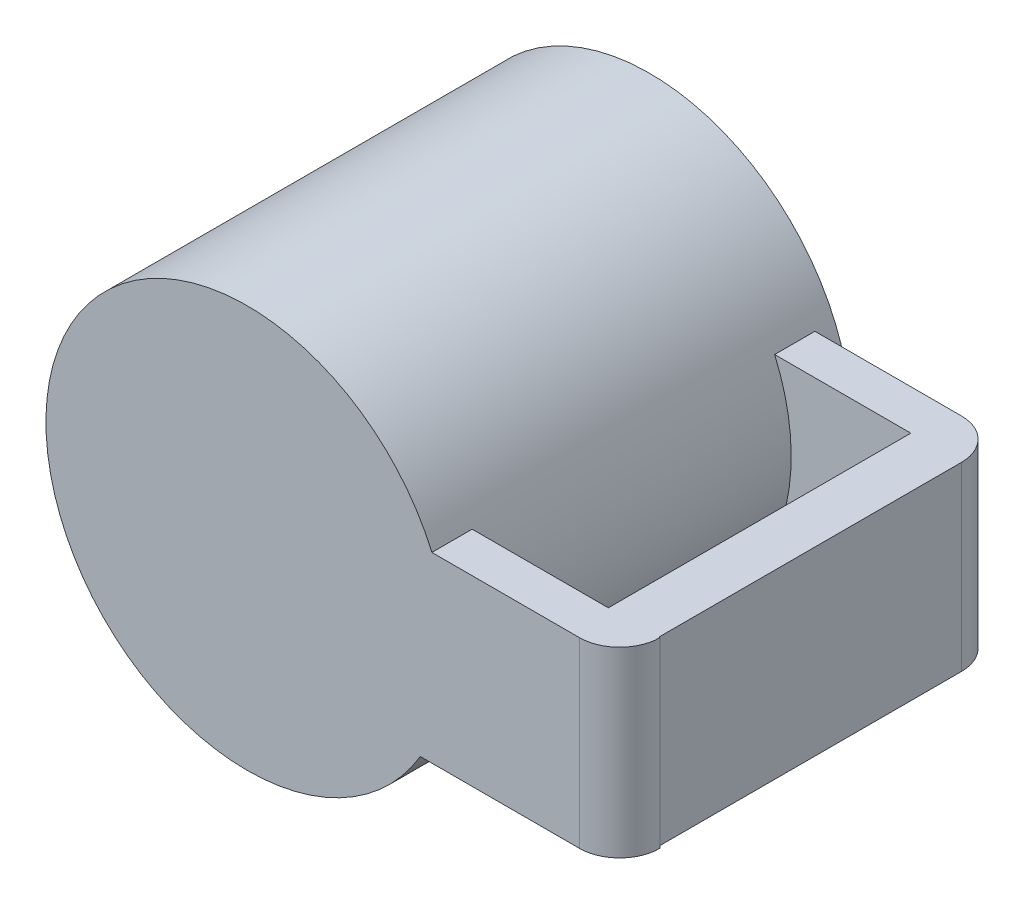
ISO-10303-21;
HEADER;
FILE_DESCRIPTION(('STEP AP214'),'2;1');
FILE_NAME('part.step','',(''),(''),'','','');
FILE_SCHEMA(('AUTOMOTIVE_DESIGN { 1 0 10303 214 1 1 1 1 }'));
ENDSEC;
DATA;
#1=APPLICATION_CONTEXT('core data for automotive mechanical design processes');
#2=APPLICATION_PROTOCOL_DEFINITION('international standard','automotive_design',2000,#1);
#3=PRODUCT_CONTEXT('',#1,'mechanical');
#4=PRODUCT('Part','Part','',(#3));
#5=PRODUCT_RELATED_PRODUCT_CATEGORY('part','',(#4));
#6=PRODUCT_DEFINITION_FORMATION('','',#4);
#7=PRODUCT_DEFINITION_CONTEXT('part definition',#1,'design');
#8=PRODUCT_DEFINITION('design','',#6,#7);
#9=PRODUCT_DEFINITION_SHAPE('','',#8);
#10=(LENGTH_UNIT() NAMED_UNIT(*) SI_UNIT(.MILLI.,.METRE.));
#11=(NAMED_UNIT(*) PLANE_ANGLE_UNIT() SI_UNIT($,.RADIAN.));
#12=(NAMED_UNIT(*) SI_UNIT($,.STERADIAN.) SOLID_ANGLE_UNIT());
#13=UNCERTAINTY_MEASURE_WITH_UNIT(LENGTH_MEASURE(1.E-05),#10,'distance_accuracy_value','');
#14=(GEOMETRIC_REPRESENTATION_CONTEXT(3) GLOBAL_UNCERTAINTY_ASSIGNED_CONTEXT((#13)) GLOBAL_UNIT_ASSIGNED_CONTEXT((#10,
#11,#12)) REPRESENTATION_CONTEXT('',''));
#15=CARTESIAN_POINT('',(0.,0.,0.));
#16=DIRECTION('',(0.,0.,1.));
#17=DIRECTION('',(1.,0.,0.));
#18=AXIS2_PLACEMENT_3D('',#15,#16,#17);
#19=CARTESIAN_POINT('',(-67.2390738972118,0.,0.));
#20=DIRECTION('',(1.,0.,0.));
#21=DIRECTION('',(0.,0.,-1.));
#22=AXIS2_PLACEMENT_3D('',#19,#20,#21);
#23=PLANE('',#22);
#24=DIRECTION('',(0.,-1.,0.));
#25=VECTOR('',#24,1.);
#26=CARTESIAN_POINT('',(-67.2390738972118,4.534999237552,0.484260169593148));
#27=LINE('',#26,#25);
#28=CARTESIAN_POINT('',(-67.2390738972118,0.0349992375519997,0.484260169593148));
#29=VERTEX_POINT('',#28);
#30=CARTESIAN_POINT('',(-67.2390738972118,0.,0.484260169593148));
#31=VERTEX_POINT('',#30);
#32=EDGE_CURVE('E125',#29,#31,#27,.T.);
#33=ORIENTED_EDGE('',*,*,#32,.F.);
#34=DIRECTION('',(0.,0.,1.));
#35=VECTOR('',#34,1.);
#36=CARTESIAN_POINT('',(-67.2390738972118,0.0349992375519997,0.484260169593148));
#37=LINE('',#36,#35);
#38=CARTESIAN_POINT('',(-67.2390738972118,0.0349992375519997,1.48364750860179));
#39=VERTEX_POINT('',#38);
#40=EDGE_CURVE('E135',#29,#39,#37,.T.);
#41=ORIENTED_EDGE('',*,*,#40,.T.);
#42=DIRECTION('',(0.,0.0349992375519997,0.999387339008644));
#43=VECTOR('',#42,1.);
#44=CARTESIAN_POINT('',(-67.2390738972118,0.0349992375519997,1.48364750860179));
#45=LINE('',#44,#43);
#46=EDGE_CURVE('E144',#31,#39,#45,.T.);
#47=ORIENTED_EDGE('',*,*,#46,.F.);
#48=EDGE_LOOP('',(#33,#41,#47));
#49=FACE_BOUND('',#48,.T.);
#50=ADVANCED_FACE('F33',(#49),#23,.T.);
#51=CARTESIAN_POINT('',(-75.2117108329897,2.55000000000001,10.));
#52=DIRECTION('',(0.,0.,-1.));
#53=DIRECTION('',(-1.,0.,0.));
#54=AXIS2_PLACEMENT_3D('',#51,#52,#53);
#55=CYLINDRICAL_SURFACE('',#54,5.);
#56=DIRECTION('',(0.,0.,-1.));
#57=VECTOR('',#56,1.);
#58=CARTESIAN_POINT('',(-70.9108388283841,0.,10.));
#59=LINE('',#58,#57);
#60=CARTESIAN_POINT('',(-70.9108388283841,0.,10.));
#61=VERTEX_POINT('',#60);
#62=CARTESIAN_POINT('',(-70.9108388283841,0.,9.));
#63=VERTEX_POINT('',#62);
#64=EDGE_CURVE('E178',#61,#63,#59,.T.);
#65=ORIENTED_EDGE('',*,*,#64,.F.);
#66=CARTESIAN_POINT('',(-75.2117108329897,2.55000000000001,10.));
#67=DIRECTION('',(0.,0.,1.));
#68=DIRECTION('',(1.,0.,0.));
#69=AXIS2_PLACEMENT_3D('',#66,#67,#68);
#70=CIRCLE('',#69,5.);
#71=CARTESIAN_POINT('',(-70.6226174555437,4.534999237552,10.));
#72=VERTEX_POINT('',#71);
#73=EDGE_CURVE('E182',#72,#61,#70,.T.);
#74=ORIENTED_EDGE('',*,*,#73,.F.);
#75=DIRECTION('',(0.,0.,-1.));
#76=VECTOR('',#75,1.);
#77=CARTESIAN_POINT('',(-70.6226174555437,4.534999237552,10.));
#78=LINE('',#77,#76);
#79=CARTESIAN_POINT('',(-70.6226174555437,4.534999237552,9.));
#80=VERTEX_POINT('',#79);
#81=EDGE_CURVE('E169',#80,#72,#78,.F.);
#82=ORIENTED_EDGE('',*,*,#81,.F.);
#83=CARTESIAN_POINT('',(-75.2117108329897,2.55000000000001,9.));
#84=DIRECTION('',(0.,0.,-1.));
#85=DIRECTION('',(-1.,0.,0.));
#86=AXIS2_PLACEMENT_3D('',#83,#84,#85);
#87=CIRCLE('',#86,5.);
#88=EDGE_CURVE('E185',#80,#63,#87,.T.);
#89=ORIENTED_EDGE('',*,*,#88,.T.);
#90=EDGE_LOOP('',(#65,#74,#82,#89));
#91=FACE_BOUND('',#90,.T.);
#92=CARTESIAN_POINT('',(-75.2117108329897,2.55000000000001,0.));
#93=DIRECTION('',(0.,0.,1.));
#94=DIRECTION('',(1.,0.,0.));
#95=AXIS2_PLACEMENT_3D('',#92,#93,#94);
#96=CIRCLE('',#95,5.);
#97=CARTESIAN_POINT('',(-70.2117108329897,2.55000000000001,0.));
#98=VERTEX_POINT('',#97);
#99=EDGE_CURVE('E181',#98,#98,#96,.T.);
#100=ORIENTED_EDGE('',*,*,#99,.T.);
#101=EDGE_LOOP('',(#100));
#102=FACE_BOUND('',#101,.T.);
#103=DIRECTION('',(0.,0.,-1.));
#104=VECTOR('',#103,1.);
#105=CARTESIAN_POINT('',(-70.6226174555437,4.534999237552,10.));
#106=LINE('',#105,#104);
#107=CARTESIAN_POINT('',(-70.6226174555437,4.534999237552,0.484260169593147));
#108=VERTEX_POINT('',#107);
#109=CARTESIAN_POINT('',(-70.6226174555437,4.534999237552,1.48364750860179));
#110=VERTEX_POINT('',#109);
#111=EDGE_CURVE('E199',#108,#110,#106,.F.);
#112=ORIENTED_EDGE('',*,*,#111,.F.);
#113=CARTESIAN_POINT('',(-75.2117108329897,2.55000000000001,0.484260169593147));
#114=DIRECTION('',(0.,0.,1.));
#115=DIRECTION('',(1.,0.,0.));
#116=AXIS2_PLACEMENT_3D('',#113,#114,#115);
#117=CIRCLE('',#116,5.);
#118=CARTESIAN_POINT('',(-70.9108388283841,0.,0.484260169593148));
#119=VERTEX_POINT('',#118);
#120=EDGE_CURVE('E196',#119,#108,#117,.T.);
#121=ORIENTED_EDGE('',*,*,#120,.F.);
#122=CARTESIAN_POINT('',(-75.2117108329897,2.55000000000001,73.2983524961972));
#123=DIRECTION('',(0.,0.999387339008644,-0.0349992375519997));
#124=DIRECTION('',(0.,-0.0349992375519997,-0.999387339008644));
#125=AXIS2_PLACEMENT_3D('',#122,#123,#124);
#126=ELLIPSE('',#125,142.860254957592,5.);
#127=CARTESIAN_POINT('',(-70.8902792224136,0.0349992375519997,1.48364750860179));
#128=VERTEX_POINT('',#127);
#129=EDGE_CURVE('E193',#128,#119,#126,.T.);
#130=ORIENTED_EDGE('',*,*,#129,.F.);
#131=CARTESIAN_POINT('',(-75.2117108329897,2.55000000000001,1.48364750860179));
#132=DIRECTION('',(0.,0.,-1.));
#133=DIRECTION('',(0.,1.,0.));
#134=AXIS2_PLACEMENT_3D('',#131,#132,#133);
#135=CIRCLE('',#134,5.);
#136=EDGE_CURVE('E190',#110,#128,#135,.T.);
#137=ORIENTED_EDGE('',*,*,#136,.F.);
#138=EDGE_LOOP('',(#112,#121,#130,#137));
#139=FACE_BOUND('',#138,.T.);
#140=ADVANCED_FACE('F235',(#91,#102,#139),#55,.T.);
#141=CARTESIAN_POINT('',(-75.2117108329897,2.55000000000001,10.));
#142=DIRECTION('',(0.,0.,1.));
#143=DIRECTION('',(1.,0.,0.));
#144=AXIS2_PLACEMENT_3D('',#141,#142,#143);
#145=PLANE('',#144);
#146=DIRECTION('',(1.,0.,0.));
#147=VECTOR('',#146,1.);
#148=CARTESIAN_POINT('',(-65.9566982139265,0.,10.));
#149=LINE('',#148,#147);
#150=CARTESIAN_POINT('',(-66.9566982139265,0.,10.));
#151=VERTEX_POINT('',#150);
#152=EDGE_CURVE('E164',#61,#151,#149,.T.);
#153=ORIENTED_EDGE('',*,*,#152,.T.);
#154=DIRECTION('',(0.,1.,0.));
#155=VECTOR('',#154,1.);
#156=CARTESIAN_POINT('',(-66.9566982139265,4.534999237552,10.));
#157=LINE('',#156,#155);
#158=CARTESIAN_POINT('',(-66.9566982139265,4.534999237552,10.));
#159=VERTEX_POINT('',#158);
#160=EDGE_CURVE('E218',#151,#159,#157,.T.);
#161=ORIENTED_EDGE('',*,*,#160,.T.);
#162=DIRECTION('',(-1.,0.,0.));
#163=VECTOR('',#162,1.);
#164=CARTESIAN_POINT('',(-73.0773399795081,4.534999237552,10.));
#165=LINE('',#164,#163);
#166=EDGE_CURVE('E166',#159,#72,#165,.T.);
#167=ORIENTED_EDGE('',*,*,#166,.T.);
#168=ORIENTED_EDGE('',*,*,#73,.T.);
#169=EDGE_LOOP('',(#153,#161,#167,#168));
#170=FACE_BOUND('',#169,.T.);
#171=ADVANCED_FACE('F230',(#170),#145,.T.);
#172=CARTESIAN_POINT('',(-75.2117108329897,2.55000000000001,0.));
#173=DIRECTION('',(0.,0.,1.));
#174=DIRECTION('',(1.,0.,0.));
#175=AXIS2_PLACEMENT_3D('',#172,#173,#174);
#176=PLANE('',#175);
#177=ORIENTED_EDGE('',*,*,#99,.F.);
#178=EDGE_LOOP('',(#177));
#179=FACE_BOUND('',#178,.T.);
#180=ADVANCED_FACE('F284',(#179),#176,.F.);
#181=CARTESIAN_POINT('',(-65.9566982139265,0.,10.));
#182=DIRECTION('',(0.,1.,0.));
#183=DIRECTION('',(0.,0.,1.));
#184=AXIS2_PLACEMENT_3D('',#181,#182,#183);
#185=PLANE('',#184);
#186=DIRECTION('',(1.,0.,0.));
#187=VECTOR('',#186,1.);
#188=CARTESIAN_POINT('',(-65.9566982139265,0.,9.));
#189=LINE('',#188,#187);
#190=CARTESIAN_POINT('',(-65.9566982139265,0.,9.));
#191=VERTEX_POINT('',#190);
#192=EDGE_CURVE('E163',#63,#191,#189,.T.);
#193=ORIENTED_EDGE('',*,*,#192,.T.);
#194=CARTESIAN_POINT('',(-66.9566982139265,0.,9.));
#195=DIRECTION('',(0.,1.,0.));
#196=DIRECTION('',(0.,0.,1.));
#197=AXIS2_PLACEMENT_3D('',#194,#195,#196);
#198=CIRCLE('',#197,1.);
#199=EDGE_CURVE('E11',#191,#151,#198,.F.);
#200=ORIENTED_EDGE('',*,*,#199,.T.);
#201=ORIENTED_EDGE('',*,*,#152,.F.);
#202=ORIENTED_EDGE('',*,*,#64,.T.);
#203=EDGE_LOOP('',(#193,#200,#201,#202));
#204=FACE_BOUND('',#203,.T.);
#205=ADVANCED_FACE('F233',(#204),#185,.F.);
#206=CARTESIAN_POINT('',(-73.0773399795081,4.534999237552,10.));
#207=DIRECTION('',(0.,-1.,0.));
#208=DIRECTION('',(0.,0.,-1.));
#209=AXIS2_PLACEMENT_3D('',#206,#207,#208);
#210=PLANE('',#209);
#211=ORIENTED_EDGE('',*,*,#166,.F.);
#212=CARTESIAN_POINT('',(-66.9566982139265,4.534999237552,9.));
#213=DIRECTION('',(0.,-1.,0.));
#214=DIRECTION('',(0.,0.,-1.));
#215=AXIS2_PLACEMENT_3D('',#212,#213,#214);
#216=CIRCLE('',#215,1.);
#217=CARTESIAN_POINT('',(-65.9566982139265,4.534999237552,9.));
#218=VERTEX_POINT('',#217);
#219=EDGE_CURVE('E41',#159,#218,#216,.F.);
#220=ORIENTED_EDGE('',*,*,#219,.T.);
#221=DIRECTION('',(-1.,0.,0.));
#222=VECTOR('',#221,1.);
#223=CARTESIAN_POINT('',(-73.0773399795081,4.534999237552,9.));
#224=LINE('',#223,#222);
#225=CARTESIAN_POINT('',(-65.9814203588958,4.534999237552,9.));
#226=VERTEX_POINT('',#225);
#227=EDGE_CURVE('E167',#218,#226,#224,.T.);
#228=ORIENTED_EDGE('',*,*,#227,.T.);
#229=DIRECTION('',(0.,0.,-1.));
#230=VECTOR('',#229,1.);
#231=CARTESIAN_POINT('',(-65.9814203588958,4.534999237552,9.48426016959315));
#232=LINE('',#231,#230);
#233=CARTESIAN_POINT('',(-65.9814203588958,4.534999237552,1.48426016959315));
#234=VERTEX_POINT('',#233);
#235=EDGE_CURVE('E242',#226,#234,#232,.T.);
#236=ORIENTED_EDGE('',*,*,#235,.T.);
#237=CARTESIAN_POINT('',(-66.9814203588958,4.534999237552,1.48426016959315));
#238=DIRECTION('',(0.,-1.,0.));
#239=DIRECTION('',(0.,0.,-1.));
#240=AXIS2_PLACEMENT_3D('',#237,#238,#239);
#241=CIRCLE('',#240,1.);
#242=CARTESIAN_POINT('',(-66.9814203588958,4.534999237552,0.484260169593148));
#243=VERTEX_POINT('',#242);
#244=EDGE_CURVE('E213',#234,#243,#241,.F.);
#245=ORIENTED_EDGE('',*,*,#244,.T.);
#246=DIRECTION('',(1.,0.,0.));
#247=VECTOR('',#246,1.);
#248=CARTESIAN_POINT('',(-73.2390738972119,4.534999237552,0.484260169593148));
#249=LINE('',#248,#247);
#250=EDGE_CURVE('E161',#108,#243,#249,.T.);
#251=ORIENTED_EDGE('',*,*,#250,.F.);
#252=ORIENTED_EDGE('',*,*,#111,.T.);
#253=DIRECTION('',(1.,0.,0.));
#254=VECTOR('',#253,1.);
#255=CARTESIAN_POINT('',(-73.2390738972119,4.534999237552,1.48364750860179));
#256=LINE('',#255,#254);
#257=CARTESIAN_POINT('',(-67.2390738972118,4.534999237552,1.48364750860179));
#258=VERTEX_POINT('',#257);
#259=EDGE_CURVE('E154',#110,#258,#256,.T.);
#260=ORIENTED_EDGE('',*,*,#259,.T.);
#261=DIRECTION('',(0.,0.,1.));
#262=VECTOR('',#261,1.);
#263=CARTESIAN_POINT('',(-67.2390738972118,4.534999237552,0.484260169593148));
#264=LINE('',#263,#262);
#265=CARTESIAN_POINT('',(-67.2390738972118,4.534999237552,9.));
#266=VERTEX_POINT('',#265);
#267=EDGE_CURVE('E149',#258,#266,#264,.T.);
#268=ORIENTED_EDGE('',*,*,#267,.T.);
#269=EDGE_CURVE('E173',#266,#80,#224,.T.);
#270=ORIENTED_EDGE('',*,*,#269,.T.);
#271=ORIENTED_EDGE('',*,*,#81,.T.);
#272=EDGE_LOOP('',(#211,#220,#228,#236,#245,#251,#252,#260,#268,#270,#271));
#273=FACE_BOUND('',#272,.T.);
#274=ADVANCED_FACE('F222',(#273),#210,.F.);
#275=CARTESIAN_POINT('',(0.,0.,9.));
#276=DIRECTION('',(0.,0.,-1.));
#277=DIRECTION('',(-1.,0.,0.));
#278=AXIS2_PLACEMENT_3D('',#275,#276,#277);
#279=PLANE('',#278);
#280=DIRECTION('',(0.,1.,0.));
#281=VECTOR('',#280,1.);
#282=CARTESIAN_POINT('',(-67.2390738972118,0.,9.));
#283=LINE('',#282,#281);
#284=CARTESIAN_POINT('',(-67.2390738972118,0.0349992375519997,9.));
#285=VERTEX_POINT('',#284);
#286=EDGE_CURVE('E207',#285,#266,#283,.T.);
#287=ORIENTED_EDGE('',*,*,#286,.F.);
#288=DIRECTION('',(1.,0.,0.));
#289=VECTOR('',#288,1.);
#290=CARTESIAN_POINT('',(0.,0.0349992375519997,9.));
#291=LINE('',#290,#289);
#292=CARTESIAN_POINT('',(-65.9814203588958,0.0349992375519997,9.));
#293=VERTEX_POINT('',#292);
#294=EDGE_CURVE('E202',#285,#293,#291,.T.);
#295=ORIENTED_EDGE('',*,*,#294,.T.);
#296=DIRECTION('',(0.,-1.,0.));
#297=VECTOR('',#296,1.);
#298=CARTESIAN_POINT('',(-65.9814203588958,0.,9.));
#299=LINE('',#298,#297);
#300=EDGE_CURVE('E205',#226,#293,#299,.T.);
#301=ORIENTED_EDGE('',*,*,#300,.F.);
#302=ORIENTED_EDGE('',*,*,#227,.F.);
#303=DIRECTION('',(0.,1.,0.));
#304=VECTOR('',#303,1.);
#305=CARTESIAN_POINT('',(-65.9566982139265,4.534999237552,9.));
#306=LINE('',#305,#304);
#307=EDGE_CURVE('E171',#191,#218,#306,.T.);
#308=ORIENTED_EDGE('',*,*,#307,.F.);
#309=ORIENTED_EDGE('',*,*,#192,.F.);
#310=ORIENTED_EDGE('',*,*,#88,.F.);
#311=ORIENTED_EDGE('',*,*,#269,.F.);
#312=EDGE_LOOP('',(#287,#295,#301,#302,#308,#309,#310,#311));
#313=FACE_BOUND('',#312,.T.);
#314=ADVANCED_FACE('F228',(#313),#279,.T.);
#315=CARTESIAN_POINT('',(-73.2390738972119,4.534999237552,0.484260169593148));
#316=DIRECTION('',(0.,0.,1.));
#317=DIRECTION('',(1.,0.,0.));
#318=AXIS2_PLACEMENT_3D('',#315,#316,#317);
#319=PLANE('',#318);
#320=ORIENTED_EDGE('',*,*,#250,.T.);
#321=DIRECTION('',(0.,1.,0.));
#322=VECTOR('',#321,1.);
#323=CARTESIAN_POINT('',(-66.9814203588958,0.0349992375519997,0.484260169593148));
#324=LINE('',#323,#322);
#325=CARTESIAN_POINT('',(-66.9814203588958,0.0349992375519997,0.484260169593148));
#326=VERTEX_POINT('',#325);
#327=EDGE_CURVE('E128',#243,#326,#324,.F.);
#328=ORIENTED_EDGE('',*,*,#327,.T.);
#329=DIRECTION('',(-1.,0.,0.));
#330=VECTOR('',#329,1.);
#331=CARTESIAN_POINT('',(-65.9814203588958,0.0349992375519997,0.484260169593148));
#332=LINE('',#331,#330);
#333=EDGE_CURVE('E119',#326,#29,#332,.T.);
#334=ORIENTED_EDGE('',*,*,#333,.T.);
#335=ORIENTED_EDGE('',*,*,#32,.T.);
#336=DIRECTION('',(1.,0.,0.));
#337=VECTOR('',#336,1.);
#338=CARTESIAN_POINT('',(-73.2390738972119,0.,0.484260169593148));
#339=LINE('',#338,#337);
#340=EDGE_CURVE('E159',#119,#31,#339,.T.);
#341=ORIENTED_EDGE('',*,*,#340,.F.);
#342=ORIENTED_EDGE('',*,*,#120,.T.);
#343=EDGE_LOOP('',(#320,#328,#334,#335,#341,#342));
#344=FACE_BOUND('',#343,.T.);
#345=ADVANCED_FACE('F122',(#344),#319,.F.);
#346=CARTESIAN_POINT('',(-73.2390738972119,0.0349992375519997,1.48364750860179));
#347=DIRECTION('',(0.,0.999387339008644,-0.0349992375519997));
#348=DIRECTION('',(0.,0.0349992375519997,0.999387339008644));
#349=AXIS2_PLACEMENT_3D('',#346,#347,#348);
#350=PLANE('',#349);
#351=DIRECTION('',(1.,0.,0.));
#352=VECTOR('',#351,1.);
#353=CARTESIAN_POINT('',(-73.2390738972119,0.0349992375519997,1.48364750860179));
#354=LINE('',#353,#352);
#355=EDGE_CURVE('E157',#128,#39,#354,.T.);
#356=ORIENTED_EDGE('',*,*,#355,.F.);
#357=ORIENTED_EDGE('',*,*,#129,.T.);
#358=ORIENTED_EDGE('',*,*,#340,.T.);
#359=ORIENTED_EDGE('',*,*,#46,.T.);
#360=EDGE_LOOP('',(#356,#357,#358,#359));
#361=FACE_BOUND('',#360,.T.);
#362=ADVANCED_FACE('F271',(#361),#350,.F.);
#363=CARTESIAN_POINT('',(-73.2390738972119,4.534999237552,1.48364750860179));
#364=DIRECTION('',(0.,0.,-1.));
#365=DIRECTION('',(0.,1.,0.));
#366=AXIS2_PLACEMENT_3D('',#363,#364,#365);
#367=PLANE('',#366);
#368=ORIENTED_EDGE('',*,*,#259,.F.);
#369=ORIENTED_EDGE('',*,*,#136,.T.);
#370=ORIENTED_EDGE('',*,*,#355,.T.);
#371=DIRECTION('',(0.,1.,0.));
#372=VECTOR('',#371,1.);
#373=CARTESIAN_POINT('',(-67.2390738972118,4.534999237552,1.48364750860179));
#374=LINE('',#373,#372);
#375=EDGE_CURVE('E146',#39,#258,#374,.T.);
#376=ORIENTED_EDGE('',*,*,#375,.T.);
#377=EDGE_LOOP('',(#368,#369,#370,#376));
#378=FACE_BOUND('',#377,.T.);
#379=ADVANCED_FACE('F268',(#378),#367,.F.);
#380=CARTESIAN_POINT('',(-67.2390738972118,0.0349992375519997,0.484260169593148));
#381=DIRECTION('',(-1.,0.,0.));
#382=DIRECTION('',(0.,0.,1.));
#383=AXIS2_PLACEMENT_3D('',#380,#381,#382);
#384=PLANE('',#383);
#385=ORIENTED_EDGE('',*,*,#375,.F.);
#386=EDGE_CURVE('E131',#39,#285,#37,.T.);
#387=ORIENTED_EDGE('',*,*,#386,.T.);
#388=ORIENTED_EDGE('',*,*,#286,.T.);
#389=ORIENTED_EDGE('',*,*,#267,.F.);
#390=EDGE_LOOP('',(#385,#387,#388,#389));
#391=FACE_BOUND('',#390,.T.);
#392=ADVANCED_FACE('F243',(#391),#384,.T.);
#393=CARTESIAN_POINT('',(-65.9814203588958,0.0349992375519997,9.48426016959315));
#394=DIRECTION('',(1.,0.,0.));
#395=DIRECTION('',(0.,0.,-1.));
#396=AXIS2_PLACEMENT_3D('',#393,#394,#395);
#397=PLANE('',#396);
#398=DIRECTION('',(0.,0.,-1.));
#399=VECTOR('',#398,1.);
#400=CARTESIAN_POINT('',(-65.9814203588958,0.0349992375519997,9.48426016959315));
#401=LINE('',#400,#399);
#402=CARTESIAN_POINT('',(-65.9814203588958,0.0349992375519997,1.48426016959315));
#403=VERTEX_POINT('',#402);
#404=EDGE_CURVE('E132',#293,#403,#401,.T.);
#405=ORIENTED_EDGE('',*,*,#404,.T.);
#406=DIRECTION('',(0.,1.,0.));
#407=VECTOR('',#406,1.);
#408=CARTESIAN_POINT('',(-65.9814203588958,4.534999237552,1.48426016959315));
#409=LINE('',#408,#407);
#410=EDGE_CURVE('E210',#403,#234,#409,.T.);
#411=ORIENTED_EDGE('',*,*,#410,.T.);
#412=ORIENTED_EDGE('',*,*,#235,.F.);
#413=ORIENTED_EDGE('',*,*,#300,.T.);
#414=EDGE_LOOP('',(#405,#411,#412,#413));
#415=FACE_BOUND('',#414,.T.);
#416=ADVANCED_FACE('F248',(#415),#397,.T.);
#417=CARTESIAN_POINT('',(0.,0.0349992375519997,0.));
#418=DIRECTION('',(0.,1.,0.));
#419=DIRECTION('',(0.,0.,1.));
#420=AXIS2_PLACEMENT_3D('',#417,#418,#419);
#421=PLANE('',#420);
#422=ORIENTED_EDGE('',*,*,#333,.F.);
#423=CARTESIAN_POINT('',(-66.9814203588958,0.0349992375519997,1.48426016959315));
#424=DIRECTION('',(0.,1.,0.));
#425=DIRECTION('',(0.,0.,1.));
#426=AXIS2_PLACEMENT_3D('',#423,#424,#425);
#427=CIRCLE('',#426,1.);
#428=EDGE_CURVE('E216',#326,#403,#427,.F.);
#429=ORIENTED_EDGE('',*,*,#428,.T.);
#430=ORIENTED_EDGE('',*,*,#404,.F.);
#431=ORIENTED_EDGE('',*,*,#294,.F.);
#432=ORIENTED_EDGE('',*,*,#386,.F.);
#433=ORIENTED_EDGE('',*,*,#40,.F.);
#434=EDGE_LOOP('',(#422,#429,#430,#431,#432,#433));
#435=FACE_BOUND('',#434,.T.);
#436=ADVANCED_FACE('F136',(#435),#421,.F.);
#437=CARTESIAN_POINT('',(-66.9814203588958,0.0349992375519997,1.48426016959315));
#438=DIRECTION('',(0.,-1.,0.));
#439=DIRECTION('',(0.,0.,-1.));
#440=AXIS2_PLACEMENT_3D('',#437,#438,#439);
#441=CYLINDRICAL_SURFACE('',#440,1.);
#442=ORIENTED_EDGE('',*,*,#428,.F.);
#443=ORIENTED_EDGE('',*,*,#327,.F.);
#444=ORIENTED_EDGE('',*,*,#244,.F.);
#445=ORIENTED_EDGE('',*,*,#410,.F.);
#446=EDGE_LOOP('',(#442,#443,#444,#445));
#447=FACE_BOUND('',#446,.T.);
#448=ADVANCED_FACE('F252',(#447),#441,.T.);
#449=CARTESIAN_POINT('',(-66.9566982139265,2.55000000000001,9.));
#450=DIRECTION('',(0.,-1.,0.));
#451=DIRECTION('',(0.,0.,-1.));
#452=AXIS2_PLACEMENT_3D('',#449,#450,#451);
#453=CYLINDRICAL_SURFACE('',#452,1.);
#454=ORIENTED_EDGE('',*,*,#199,.F.);
#455=ORIENTED_EDGE('',*,*,#307,.T.);
#456=ORIENTED_EDGE('',*,*,#219,.F.);
#457=ORIENTED_EDGE('',*,*,#160,.F.);
#458=EDGE_LOOP('',(#454,#455,#456,#457));
#459=FACE_BOUND('',#458,.T.);
#460=ADVANCED_FACE('F35',(#459),#453,.T.);
#461=CLOSED_SHELL('',(#50,#140,#171,#180,#205,#274,#314,#345,#362,#379,#392,#416,#436,#448,#460));
#462=MANIFOLD_SOLID_BREP('B2',#461);
#463=ADVANCED_BREP_SHAPE_REPRESENTATION('',(#18,#462),#14);
#464=SHAPE_DEFINITION_REPRESENTATION(#9,#463);
ENDSEC;
END-ISO-10303-21;
